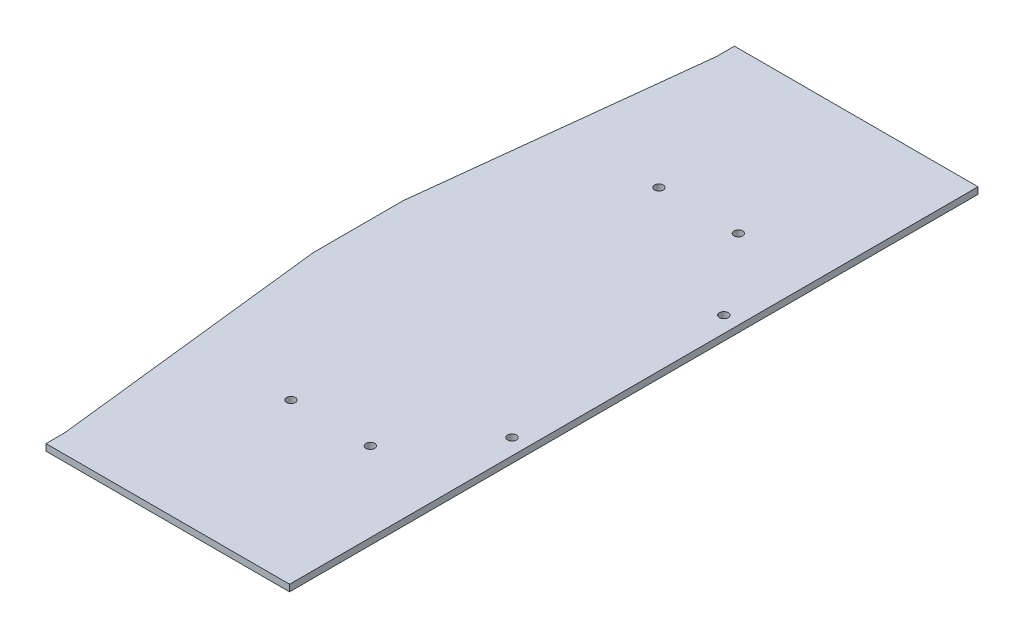
ISO-10303-21;
HEADER;
FILE_DESCRIPTION(('STEP AP214'),'2;1');
FILE_NAME('part.step','',(''),(''),'','','');
FILE_SCHEMA(('AUTOMOTIVE_DESIGN { 1 0 10303 214 1 1 1 1 }'));
ENDSEC;
DATA;
#1=APPLICATION_CONTEXT('core data for automotive mechanical design processes');
#2=APPLICATION_PROTOCOL_DEFINITION('international standard','automotive_design',2000,#1);
#3=PRODUCT_CONTEXT('',#1,'mechanical');
#4=PRODUCT('Part','Part','',(#3));
#5=PRODUCT_RELATED_PRODUCT_CATEGORY('part','',(#4));
#6=PRODUCT_DEFINITION_FORMATION('','',#4);
#7=PRODUCT_DEFINITION_CONTEXT('part definition',#1,'design');
#8=PRODUCT_DEFINITION('design','',#6,#7);
#9=PRODUCT_DEFINITION_SHAPE('','',#8);
#10=(LENGTH_UNIT() NAMED_UNIT(*) SI_UNIT(.MILLI.,.METRE.));
#11=(NAMED_UNIT(*) PLANE_ANGLE_UNIT() SI_UNIT($,.RADIAN.));
#12=(NAMED_UNIT(*) SI_UNIT($,.STERADIAN.) SOLID_ANGLE_UNIT());
#13=UNCERTAINTY_MEASURE_WITH_UNIT(LENGTH_MEASURE(1.E-05),#10,'distance_accuracy_value','');
#14=(GEOMETRIC_REPRESENTATION_CONTEXT(3) GLOBAL_UNCERTAINTY_ASSIGNED_CONTEXT((#13)) GLOBAL_UNIT_ASSIGNED_CONTEXT((#10,
#11,#12)) REPRESENTATION_CONTEXT('',''));
#15=CARTESIAN_POINT('',(0.,0.,0.));
#16=DIRECTION('',(0.,0.,1.));
#17=DIRECTION('',(1.,0.,0.));
#18=AXIS2_PLACEMENT_3D('',#15,#16,#17);
#19=CARTESIAN_POINT('',(0.,2.5,0.));
#20=DIRECTION('',(0.,1.,0.));
#21=DIRECTION('',(0.,0.,1.));
#22=AXIS2_PLACEMENT_3D('',#19,#20,#21);
#23=PLANE('',#22);
#24=CARTESIAN_POINT('',(129.120165849181,2.5,-40.7057352690958));
#25=DIRECTION('',(0.,1.,0.));
#26=DIRECTION('',(0.,0.,1.));
#27=AXIS2_PLACEMENT_3D('',#24,#25,#26);
#28=CIRCLE('',#27,1.65000000000002);
#29=CARTESIAN_POINT('',(129.120165849181,2.5,-39.0557352690958));
#30=VERTEX_POINT('',#29);
#31=EDGE_CURVE('E206',#30,#30,#28,.T.);
#32=ORIENTED_EDGE('',*,*,#31,.F.);
#33=EDGE_LOOP('',(#32));
#34=FACE_BOUND('',#33,.T.);
#35=CARTESIAN_POINT('',(75.1201658491807,2.5,68.7942647309042));
#36=DIRECTION('',(0.,1.,0.));
#37=DIRECTION('',(0.,0.,-1.));
#38=AXIS2_PLACEMENT_3D('',#35,#36,#37);
#39=CIRCLE('',#38,1.64999999999999);
#40=CARTESIAN_POINT('',(75.1201658491807,2.5,67.1442647309042));
#41=VERTEX_POINT('',#40);
#42=EDGE_CURVE('E194',#41,#41,#39,.T.);
#43=ORIENTED_EDGE('',*,*,#42,.F.);
#44=EDGE_LOOP('',(#43));
#45=FACE_BOUND('',#44,.T.);
#46=CARTESIAN_POINT('',(105.120165849181,2.5,-70.2057352690958));
#47=DIRECTION('',(0.,1.,0.));
#48=DIRECTION('',(0.,0.,1.));
#49=AXIS2_PLACEMENT_3D('',#46,#47,#48);
#50=CIRCLE('',#49,1.65);
#51=CARTESIAN_POINT('',(105.120165849181,2.5,-68.5557352690958));
#52=VERTEX_POINT('',#51);
#53=EDGE_CURVE('E136',#52,#52,#50,.T.);
#54=ORIENTED_EDGE('',*,*,#53,.F.);
#55=EDGE_LOOP('',(#54));
#56=FACE_BOUND('',#55,.T.);
#57=DIRECTION('',(1.,0.,0.));
#58=VECTOR('',#57,1.);
#59=CARTESIAN_POINT('',(43.1201658491807,2.5,129.294264730904));
#60=LINE('',#59,#58);
#61=CARTESIAN_POINT('',(43.1201658491807,2.5,129.294264730904));
#62=VERTEX_POINT('',#61);
#63=CARTESIAN_POINT('',(135.120165849181,2.5,129.294264730904));
#64=VERTEX_POINT('',#63);
#65=EDGE_CURVE('E96',#62,#64,#60,.T.);
#66=ORIENTED_EDGE('',*,*,#65,.T.);
#67=DIRECTION('',(0.,0.,-1.));
#68=VECTOR('',#67,1.);
#69=CARTESIAN_POINT('',(135.120165849181,2.5,129.294264730904));
#70=LINE('',#69,#68);
#71=CARTESIAN_POINT('',(135.120165849181,2.5,-130.705735269096));
#72=VERTEX_POINT('',#71);
#73=EDGE_CURVE('E168',#64,#72,#70,.T.);
#74=ORIENTED_EDGE('',*,*,#73,.T.);
#75=DIRECTION('',(-1.,0.,0.));
#76=VECTOR('',#75,1.);
#77=CARTESIAN_POINT('',(85.2736369996581,2.5,-130.705735269096));
#78=LINE('',#77,#76);
#79=CARTESIAN_POINT('',(43.1201658491807,2.5,-130.705735269096));
#80=VERTEX_POINT('',#79);
#81=EDGE_CURVE('E164',#72,#80,#78,.T.);
#82=ORIENTED_EDGE('',*,*,#81,.T.);
#83=DIRECTION('',(0.,0.,1.));
#84=VECTOR('',#83,1.);
#85=CARTESIAN_POINT('',(43.1201658491807,2.5,-123.705735269096));
#86=LINE('',#85,#84);
#87=CARTESIAN_POINT('',(43.1201658491807,2.5,-123.705735269096));
#88=VERTEX_POINT('',#87);
#89=EDGE_CURVE('E179',#80,#88,#86,.T.);
#90=ORIENTED_EDGE('',*,*,#89,.T.);
#91=DIRECTION('',(-0.112489015280939,0.,0.993652968314957));
#92=VECTOR('',#91,1.);
#93=CARTESIAN_POINT('',(31.1201658491807,2.5,-17.7057352690958));
#94=LINE('',#93,#92);
#95=CARTESIAN_POINT('',(31.1201658491807,2.5,-17.7057352690958));
#96=VERTEX_POINT('',#95);
#97=EDGE_CURVE('E116',#88,#96,#94,.T.);
#98=ORIENTED_EDGE('',*,*,#97,.T.);
#99=DIRECTION('',(0.,0.,1.));
#100=VECTOR('',#99,1.);
#101=CARTESIAN_POINT('',(31.1201658491807,2.5,-17.7057352690958));
#102=LINE('',#101,#100);
#103=CARTESIAN_POINT('',(31.1201658491807,2.5,16.2942647309042));
#104=VERTEX_POINT('',#103);
#105=EDGE_CURVE('E110',#96,#104,#102,.T.);
#106=ORIENTED_EDGE('',*,*,#105,.T.);
#107=DIRECTION('',(0.112489015280939,0.,0.993652968314957));
#108=VECTOR('',#107,1.);
#109=CARTESIAN_POINT('',(31.1201658491807,2.5,16.2942647309042));
#110=LINE('',#109,#108);
#111=CARTESIAN_POINT('',(43.1201658491807,2.5,122.294264730904));
#112=VERTEX_POINT('',#111);
#113=EDGE_CURVE('E114',#104,#112,#110,.T.);
#114=ORIENTED_EDGE('',*,*,#113,.T.);
#115=DIRECTION('',(0.,0.,1.));
#116=VECTOR('',#115,1.);
#117=CARTESIAN_POINT('',(43.1201658491807,2.5,122.294264730904));
#118=LINE('',#117,#116);
#119=EDGE_CURVE('E54',#112,#62,#118,.T.);
#120=ORIENTED_EDGE('',*,*,#119,.T.);
#121=EDGE_LOOP('',(#66,#74,#82,#90,#98,#106,#114,#120));
#122=FACE_BOUND('',#121,.T.);
#123=CARTESIAN_POINT('',(75.1201658491807,2.5,-70.2057352690958));
#124=DIRECTION('',(0.,1.,0.));
#125=DIRECTION('',(0.,0.,1.));
#126=AXIS2_PLACEMENT_3D('',#123,#124,#125);
#127=CIRCLE('',#126,1.65);
#128=CARTESIAN_POINT('',(75.1201658491807,2.5,-68.5557352690958));
#129=VERTEX_POINT('',#128);
#130=EDGE_CURVE('E188',#129,#129,#127,.T.);
#131=ORIENTED_EDGE('',*,*,#130,.F.);
#132=EDGE_LOOP('',(#131));
#133=FACE_BOUND('',#132,.T.);
#134=CARTESIAN_POINT('',(105.120165849181,2.5,68.7942647309042));
#135=DIRECTION('',(0.,1.,0.));
#136=DIRECTION('',(0.,0.,-1.));
#137=AXIS2_PLACEMENT_3D('',#134,#135,#136);
#138=CIRCLE('',#137,1.65);
#139=CARTESIAN_POINT('',(105.120165849181,2.5,67.1442647309042));
#140=VERTEX_POINT('',#139);
#141=EDGE_CURVE('E200',#140,#140,#138,.T.);
#142=ORIENTED_EDGE('',*,*,#141,.F.);
#143=EDGE_LOOP('',(#142));
#144=FACE_BOUND('',#143,.T.);
#145=CARTESIAN_POINT('',(129.120165849181,2.5,39.2942647309042));
#146=DIRECTION('',(0.,1.,0.));
#147=DIRECTION('',(0.,0.,-1.));
#148=AXIS2_PLACEMENT_3D('',#145,#146,#147);
#149=CIRCLE('',#148,1.65000000000002);
#150=CARTESIAN_POINT('',(129.120165849181,2.5,37.6442647309042));
#151=VERTEX_POINT('',#150);
#152=EDGE_CURVE('E212',#151,#151,#149,.T.);
#153=ORIENTED_EDGE('',*,*,#152,.F.);
#154=EDGE_LOOP('',(#153));
#155=FACE_BOUND('',#154,.T.);
#156=ADVANCED_FACE('F37',(#34,#45,#56,#122,#133,#144,#155),#23,.T.);
#157=CARTESIAN_POINT('',(0.,0.,0.));
#158=DIRECTION('',(0.,1.,0.));
#159=DIRECTION('',(0.,0.,1.));
#160=AXIS2_PLACEMENT_3D('',#157,#158,#159);
#161=PLANE('',#160);
#162=DIRECTION('',(1.,0.,0.));
#163=VECTOR('',#162,1.);
#164=CARTESIAN_POINT('',(85.2736369996581,0.,129.294264730904));
#165=LINE('',#164,#163);
#166=CARTESIAN_POINT('',(43.1201658491807,0.,129.294264730904));
#167=VERTEX_POINT('',#166);
#168=CARTESIAN_POINT('',(135.120165849181,0.,129.294264730904));
#169=VERTEX_POINT('',#168);
#170=EDGE_CURVE('E90',#167,#169,#165,.T.);
#171=ORIENTED_EDGE('',*,*,#170,.F.);
#172=DIRECTION('',(0.,0.,1.));
#173=VECTOR('',#172,1.);
#174=CARTESIAN_POINT('',(43.1201658491807,0.,122.294264730904));
#175=LINE('',#174,#173);
#176=CARTESIAN_POINT('',(43.1201658491807,0.,122.294264730904));
#177=VERTEX_POINT('',#176);
#178=EDGE_CURVE('E147',#177,#167,#175,.T.);
#179=ORIENTED_EDGE('',*,*,#178,.F.);
#180=DIRECTION('',(0.112489015280939,0.,0.993652968314957));
#181=VECTOR('',#180,1.);
#182=CARTESIAN_POINT('',(31.1201658491807,0.,16.2942647309042));
#183=LINE('',#182,#181);
#184=CARTESIAN_POINT('',(31.1201658491807,0.,16.2942647309042));
#185=VERTEX_POINT('',#184);
#186=EDGE_CURVE('E83',#185,#177,#183,.T.);
#187=ORIENTED_EDGE('',*,*,#186,.F.);
#188=DIRECTION('',(0.,0.,1.));
#189=VECTOR('',#188,1.);
#190=CARTESIAN_POINT('',(31.1201658491807,0.,-17.7057352690958));
#191=LINE('',#190,#189);
#192=CARTESIAN_POINT('',(31.1201658491807,0.,-17.7057352690958));
#193=VERTEX_POINT('',#192);
#194=EDGE_CURVE('E124',#193,#185,#191,.T.);
#195=ORIENTED_EDGE('',*,*,#194,.F.);
#196=DIRECTION('',(-0.112489015280939,0.,0.993652968314957));
#197=VECTOR('',#196,1.);
#198=CARTESIAN_POINT('',(31.1201658491807,0.,-17.7057352690958));
#199=LINE('',#198,#197);
#200=CARTESIAN_POINT('',(43.1201658491807,0.,-123.705735269096));
#201=VERTEX_POINT('',#200);
#202=EDGE_CURVE('E143',#201,#193,#199,.T.);
#203=ORIENTED_EDGE('',*,*,#202,.F.);
#204=DIRECTION('',(0.,0.,1.));
#205=VECTOR('',#204,1.);
#206=CARTESIAN_POINT('',(43.1201658491807,0.,-123.705735269096));
#207=LINE('',#206,#205);
#208=CARTESIAN_POINT('',(43.1201658491807,0.,-130.705735269096));
#209=VERTEX_POINT('',#208);
#210=EDGE_CURVE('E141',#209,#201,#207,.T.);
#211=ORIENTED_EDGE('',*,*,#210,.F.);
#212=DIRECTION('',(-1.,0.,0.));
#213=VECTOR('',#212,1.);
#214=CARTESIAN_POINT('',(43.1201658491807,0.,-130.705735269096));
#215=LINE('',#214,#213);
#216=CARTESIAN_POINT('',(135.120165849181,0.,-130.705735269096));
#217=VERTEX_POINT('',#216);
#218=EDGE_CURVE('E139',#217,#209,#215,.T.);
#219=ORIENTED_EDGE('',*,*,#218,.F.);
#220=DIRECTION('',(0.,0.,-1.));
#221=VECTOR('',#220,1.);
#222=CARTESIAN_POINT('',(135.120165849181,0.,129.294264730904));
#223=LINE('',#222,#221);
#224=EDGE_CURVE('E135',#169,#217,#223,.T.);
#225=ORIENTED_EDGE('',*,*,#224,.F.);
#226=EDGE_LOOP('',(#171,#179,#187,#195,#203,#211,#219,#225));
#227=FACE_BOUND('',#226,.T.);
#228=CARTESIAN_POINT('',(105.120165849181,0.,-70.2057352690958));
#229=DIRECTION('',(0.,1.,0.));
#230=DIRECTION('',(0.,0.,1.));
#231=AXIS2_PLACEMENT_3D('',#228,#229,#230);
#232=CIRCLE('',#231,1.65);
#233=CARTESIAN_POINT('',(105.120165849181,0.,-68.5557352690958));
#234=VERTEX_POINT('',#233);
#235=EDGE_CURVE('E185',#234,#234,#232,.T.);
#236=ORIENTED_EDGE('',*,*,#235,.T.);
#237=EDGE_LOOP('',(#236));
#238=FACE_BOUND('',#237,.T.);
#239=CARTESIAN_POINT('',(75.1201658491807,0.,-70.2057352690958));
#240=DIRECTION('',(0.,1.,0.));
#241=DIRECTION('',(0.,0.,1.));
#242=AXIS2_PLACEMENT_3D('',#239,#240,#241);
#243=CIRCLE('',#242,1.65);
#244=CARTESIAN_POINT('',(75.1201658491807,0.,-68.5557352690958));
#245=VERTEX_POINT('',#244);
#246=EDGE_CURVE('E191',#245,#245,#243,.T.);
#247=ORIENTED_EDGE('',*,*,#246,.T.);
#248=EDGE_LOOP('',(#247));
#249=FACE_BOUND('',#248,.T.);
#250=CARTESIAN_POINT('',(75.1201658491807,0.,68.7942647309042));
#251=DIRECTION('',(0.,1.,0.));
#252=DIRECTION('',(0.,0.,-1.));
#253=AXIS2_PLACEMENT_3D('',#250,#251,#252);
#254=CIRCLE('',#253,1.64999999999999);
#255=CARTESIAN_POINT('',(75.1201658491807,0.,67.1442647309042));
#256=VERTEX_POINT('',#255);
#257=EDGE_CURVE('E197',#256,#256,#254,.T.);
#258=ORIENTED_EDGE('',*,*,#257,.T.);
#259=EDGE_LOOP('',(#258));
#260=FACE_BOUND('',#259,.T.);
#261=CARTESIAN_POINT('',(105.120165849181,0.,68.7942647309042));
#262=DIRECTION('',(0.,1.,0.));
#263=DIRECTION('',(0.,0.,-1.));
#264=AXIS2_PLACEMENT_3D('',#261,#262,#263);
#265=CIRCLE('',#264,1.65);
#266=CARTESIAN_POINT('',(105.120165849181,0.,67.1442647309042));
#267=VERTEX_POINT('',#266);
#268=EDGE_CURVE('E203',#267,#267,#265,.T.);
#269=ORIENTED_EDGE('',*,*,#268,.T.);
#270=EDGE_LOOP('',(#269));
#271=FACE_BOUND('',#270,.T.);
#272=CARTESIAN_POINT('',(129.120165849181,0.,-40.7057352690958));
#273=DIRECTION('',(0.,1.,0.));
#274=DIRECTION('',(0.,0.,1.));
#275=AXIS2_PLACEMENT_3D('',#272,#273,#274);
#276=CIRCLE('',#275,1.65000000000002);
#277=CARTESIAN_POINT('',(129.120165849181,0.,-39.0557352690958));
#278=VERTEX_POINT('',#277);
#279=EDGE_CURVE('E209',#278,#278,#276,.T.);
#280=ORIENTED_EDGE('',*,*,#279,.T.);
#281=EDGE_LOOP('',(#280));
#282=FACE_BOUND('',#281,.T.);
#283=CARTESIAN_POINT('',(129.120165849181,0.,39.2942647309042));
#284=DIRECTION('',(0.,1.,0.));
#285=DIRECTION('',(0.,0.,-1.));
#286=AXIS2_PLACEMENT_3D('',#283,#284,#285);
#287=CIRCLE('',#286,1.65000000000002);
#288=CARTESIAN_POINT('',(129.120165849181,0.,37.6442647309042));
#289=VERTEX_POINT('',#288);
#290=EDGE_CURVE('E215',#289,#289,#287,.T.);
#291=ORIENTED_EDGE('',*,*,#290,.T.);
#292=EDGE_LOOP('',(#291));
#293=FACE_BOUND('',#292,.T.);
#294=ADVANCED_FACE('F169',(#227,#238,#249,#260,#271,#282,#293),#161,.F.);
#295=CARTESIAN_POINT('',(85.2736369996581,2.5,129.294264730904));
#296=DIRECTION('',(0.,0.,-1.));
#297=DIRECTION('',(-1.,0.,0.));
#298=AXIS2_PLACEMENT_3D('',#295,#296,#297);
#299=PLANE('',#298);
#300=ORIENTED_EDGE('',*,*,#170,.T.);
#301=DIRECTION('',(0.,-1.,0.));
#302=VECTOR('',#301,1.);
#303=CARTESIAN_POINT('',(135.120165849181,2.5,129.294264730904));
#304=LINE('',#303,#302);
#305=EDGE_CURVE('E11',#64,#169,#304,.T.);
#306=ORIENTED_EDGE('',*,*,#305,.F.);
#307=ORIENTED_EDGE('',*,*,#65,.F.);
#308=DIRECTION('',(0.,-1.,0.));
#309=VECTOR('',#308,1.);
#310=CARTESIAN_POINT('',(43.1201658491807,2.5,129.294264730904));
#311=LINE('',#310,#309);
#312=EDGE_CURVE('E130',#62,#167,#311,.T.);
#313=ORIENTED_EDGE('',*,*,#312,.T.);
#314=EDGE_LOOP('',(#300,#306,#307,#313));
#315=FACE_BOUND('',#314,.T.);
#316=ADVANCED_FACE('F39',(#315),#299,.F.);
#317=CARTESIAN_POINT('',(135.120165849181,2.5,129.294264730904));
#318=DIRECTION('',(-1.,0.,0.));
#319=DIRECTION('',(0.,0.,1.));
#320=AXIS2_PLACEMENT_3D('',#317,#318,#319);
#321=PLANE('',#320);
#322=ORIENTED_EDGE('',*,*,#224,.T.);
#323=DIRECTION('',(0.,-1.,0.));
#324=VECTOR('',#323,1.);
#325=CARTESIAN_POINT('',(135.120165849181,2.5,-130.705735269096));
#326=LINE('',#325,#324);
#327=EDGE_CURVE('E46',#72,#217,#326,.T.);
#328=ORIENTED_EDGE('',*,*,#327,.F.);
#329=ORIENTED_EDGE('',*,*,#73,.F.);
#330=ORIENTED_EDGE('',*,*,#305,.T.);
#331=EDGE_LOOP('',(#322,#328,#329,#330));
#332=FACE_BOUND('',#331,.T.);
#333=ADVANCED_FACE('F167',(#332),#321,.F.);
#334=CARTESIAN_POINT('',(43.1201658491807,2.5,-130.705735269096));
#335=DIRECTION('',(0.,0.,1.));
#336=DIRECTION('',(1.,0.,0.));
#337=AXIS2_PLACEMENT_3D('',#334,#335,#336);
#338=PLANE('',#337);
#339=ORIENTED_EDGE('',*,*,#218,.T.);
#340=DIRECTION('',(0.,-1.,0.));
#341=VECTOR('',#340,1.);
#342=CARTESIAN_POINT('',(43.1201658491807,2.5,-130.705735269096));
#343=LINE('',#342,#341);
#344=EDGE_CURVE('E156',#80,#209,#343,.T.);
#345=ORIENTED_EDGE('',*,*,#344,.F.);
#346=ORIENTED_EDGE('',*,*,#81,.F.);
#347=ORIENTED_EDGE('',*,*,#327,.T.);
#348=EDGE_LOOP('',(#339,#345,#346,#347));
#349=FACE_BOUND('',#348,.T.);
#350=ADVANCED_FACE('F162',(#349),#338,.F.);
#351=CARTESIAN_POINT('',(43.1201658491807,2.5,-123.705735269096));
#352=DIRECTION('',(1.,0.,0.));
#353=DIRECTION('',(0.,0.,-1.));
#354=AXIS2_PLACEMENT_3D('',#351,#352,#353);
#355=PLANE('',#354);
#356=ORIENTED_EDGE('',*,*,#210,.T.);
#357=DIRECTION('',(0.,-1.,0.));
#358=VECTOR('',#357,1.);
#359=CARTESIAN_POINT('',(43.1201658491807,2.5,-123.705735269096));
#360=LINE('',#359,#358);
#361=EDGE_CURVE('E153',#88,#201,#360,.T.);
#362=ORIENTED_EDGE('',*,*,#361,.F.);
#363=ORIENTED_EDGE('',*,*,#89,.F.);
#364=ORIENTED_EDGE('',*,*,#344,.T.);
#365=EDGE_LOOP('',(#356,#362,#363,#364));
#366=FACE_BOUND('',#365,.T.);
#367=ADVANCED_FACE('F175',(#366),#355,.F.);
#368=CARTESIAN_POINT('',(31.1201658491807,2.5,-17.7057352690958));
#369=DIRECTION('',(0.993652968314957,0.,0.112489015280939));
#370=DIRECTION('',(0.112489015280939,0.,-0.993652968314957));
#371=AXIS2_PLACEMENT_3D('',#368,#369,#370);
#372=PLANE('',#371);
#373=ORIENTED_EDGE('',*,*,#202,.T.);
#374=DIRECTION('',(0.,-1.,0.));
#375=VECTOR('',#374,1.);
#376=CARTESIAN_POINT('',(31.1201658491807,2.5,-17.7057352690958));
#377=LINE('',#376,#375);
#378=EDGE_CURVE('E125',#96,#193,#377,.T.);
#379=ORIENTED_EDGE('',*,*,#378,.F.);
#380=ORIENTED_EDGE('',*,*,#97,.F.);
#381=ORIENTED_EDGE('',*,*,#361,.T.);
#382=EDGE_LOOP('',(#373,#379,#380,#381));
#383=FACE_BOUND('',#382,.T.);
#384=ADVANCED_FACE('F178',(#383),#372,.F.);
#385=CARTESIAN_POINT('',(31.1201658491807,2.5,-17.7057352690958));
#386=DIRECTION('',(1.,0.,0.));
#387=DIRECTION('',(0.,0.,-1.));
#388=AXIS2_PLACEMENT_3D('',#385,#386,#387);
#389=PLANE('',#388);
#390=ORIENTED_EDGE('',*,*,#194,.T.);
#391=DIRECTION('',(0.,-1.,0.));
#392=VECTOR('',#391,1.);
#393=CARTESIAN_POINT('',(31.1201658491807,2.5,16.2942647309042));
#394=LINE('',#393,#392);
#395=EDGE_CURVE('E121',#104,#185,#394,.T.);
#396=ORIENTED_EDGE('',*,*,#395,.F.);
#397=ORIENTED_EDGE('',*,*,#105,.F.);
#398=ORIENTED_EDGE('',*,*,#378,.T.);
#399=EDGE_LOOP('',(#390,#396,#397,#398));
#400=FACE_BOUND('',#399,.T.);
#401=ADVANCED_FACE('F122',(#400),#389,.F.);
#402=CARTESIAN_POINT('',(31.1201658491807,2.5,16.2942647309042));
#403=DIRECTION('',(0.993652968314957,0.,-0.112489015280939));
#404=DIRECTION('',(-0.112489015280939,0.,-0.993652968314957));
#405=AXIS2_PLACEMENT_3D('',#402,#403,#404);
#406=PLANE('',#405);
#407=ORIENTED_EDGE('',*,*,#186,.T.);
#408=DIRECTION('',(0.,-1.,0.));
#409=VECTOR('',#408,1.);
#410=CARTESIAN_POINT('',(43.1201658491807,2.5,122.294264730904));
#411=LINE('',#410,#409);
#412=EDGE_CURVE('E126',#112,#177,#411,.T.);
#413=ORIENTED_EDGE('',*,*,#412,.F.);
#414=ORIENTED_EDGE('',*,*,#113,.F.);
#415=ORIENTED_EDGE('',*,*,#395,.T.);
#416=EDGE_LOOP('',(#407,#413,#414,#415));
#417=FACE_BOUND('',#416,.T.);
#418=ADVANCED_FACE('F128',(#417),#406,.F.);
#419=CARTESIAN_POINT('',(43.1201658491807,2.5,122.294264730904));
#420=DIRECTION('',(1.,0.,0.));
#421=DIRECTION('',(0.,0.,-1.));
#422=AXIS2_PLACEMENT_3D('',#419,#420,#421);
#423=PLANE('',#422);
#424=ORIENTED_EDGE('',*,*,#178,.T.);
#425=ORIENTED_EDGE('',*,*,#312,.F.);
#426=ORIENTED_EDGE('',*,*,#119,.F.);
#427=ORIENTED_EDGE('',*,*,#412,.T.);
#428=EDGE_LOOP('',(#424,#425,#426,#427));
#429=FACE_BOUND('',#428,.T.);
#430=ADVANCED_FACE('F237',(#429),#423,.F.);
#431=CARTESIAN_POINT('',(105.120165849181,2.5,-70.2057352690958));
#432=DIRECTION('',(0.,-1.,0.));
#433=DIRECTION('',(0.,0.,-1.));
#434=AXIS2_PLACEMENT_3D('',#431,#432,#433);
#435=CYLINDRICAL_SURFACE('',#434,1.65);
#436=ORIENTED_EDGE('',*,*,#53,.T.);
#437=EDGE_LOOP('',(#436));
#438=FACE_BOUND('',#437,.T.);
#439=ORIENTED_EDGE('',*,*,#235,.F.);
#440=EDGE_LOOP('',(#439));
#441=FACE_BOUND('',#440,.T.);
#442=ADVANCED_FACE('F234',(#438,#441),#435,.F.);
#443=CARTESIAN_POINT('',(75.1201658491807,2.5,-70.2057352690958));
#444=DIRECTION('',(0.,-1.,0.));
#445=DIRECTION('',(0.,0.,-1.));
#446=AXIS2_PLACEMENT_3D('',#443,#444,#445);
#447=CYLINDRICAL_SURFACE('',#446,1.65);
#448=ORIENTED_EDGE('',*,*,#130,.T.);
#449=EDGE_LOOP('',(#448));
#450=FACE_BOUND('',#449,.T.);
#451=ORIENTED_EDGE('',*,*,#246,.F.);
#452=EDGE_LOOP('',(#451));
#453=FACE_BOUND('',#452,.T.);
#454=ADVANCED_FACE('F317',(#450,#453),#447,.F.);
#455=CARTESIAN_POINT('',(75.1201658491807,2.5,68.7942647309042));
#456=DIRECTION('',(0.,-1.,0.));
#457=DIRECTION('',(0.,0.,-1.));
#458=AXIS2_PLACEMENT_3D('',#455,#456,#457);
#459=CYLINDRICAL_SURFACE('',#458,1.64999999999999);
#460=ORIENTED_EDGE('',*,*,#42,.T.);
#461=EDGE_LOOP('',(#460));
#462=FACE_BOUND('',#461,.T.);
#463=ORIENTED_EDGE('',*,*,#257,.F.);
#464=EDGE_LOOP('',(#463));
#465=FACE_BOUND('',#464,.T.);
#466=ADVANCED_FACE('F325',(#462,#465),#459,.F.);
#467=CARTESIAN_POINT('',(105.120165849181,2.5,68.7942647309042));
#468=DIRECTION('',(0.,-1.,0.));
#469=DIRECTION('',(0.,0.,-1.));
#470=AXIS2_PLACEMENT_3D('',#467,#468,#469);
#471=CYLINDRICAL_SURFACE('',#470,1.65);
#472=ORIENTED_EDGE('',*,*,#141,.T.);
#473=EDGE_LOOP('',(#472));
#474=FACE_BOUND('',#473,.T.);
#475=ORIENTED_EDGE('',*,*,#268,.F.);
#476=EDGE_LOOP('',(#475));
#477=FACE_BOUND('',#476,.T.);
#478=ADVANCED_FACE('F333',(#474,#477),#471,.F.);
#479=CARTESIAN_POINT('',(129.120165849181,2.5,-40.7057352690958));
#480=DIRECTION('',(0.,-1.,0.));
#481=DIRECTION('',(0.,0.,-1.));
#482=AXIS2_PLACEMENT_3D('',#479,#480,#481);
#483=CYLINDRICAL_SURFACE('',#482,1.65000000000002);
#484=ORIENTED_EDGE('',*,*,#31,.T.);
#485=EDGE_LOOP('',(#484));
#486=FACE_BOUND('',#485,.T.);
#487=ORIENTED_EDGE('',*,*,#279,.F.);
#488=EDGE_LOOP('',(#487));
#489=FACE_BOUND('',#488,.T.);
#490=ADVANCED_FACE('F342',(#486,#489),#483,.F.);
#491=CARTESIAN_POINT('',(129.120165849181,2.5,39.2942647309042));
#492=DIRECTION('',(0.,-1.,0.));
#493=DIRECTION('',(0.,0.,-1.));
#494=AXIS2_PLACEMENT_3D('',#491,#492,#493);
#495=CYLINDRICAL_SURFACE('',#494,1.65000000000002);
#496=ORIENTED_EDGE('',*,*,#152,.T.);
#497=EDGE_LOOP('',(#496));
#498=FACE_BOUND('',#497,.T.);
#499=ORIENTED_EDGE('',*,*,#290,.F.);
#500=EDGE_LOOP('',(#499));
#501=FACE_BOUND('',#500,.T.);
#502=ADVANCED_FACE('F221',(#498,#501),#495,.F.);
#503=CLOSED_SHELL('',(#156,#294,#316,#333,#350,#367,#384,#401,#418,#430,#442,#454,#466,#478,
#490,#502));
#504=MANIFOLD_SOLID_BREP('B2',#503);
#505=ADVANCED_BREP_SHAPE_REPRESENTATION('',(#18,#504),#14);
#506=SHAPE_DEFINITION_REPRESENTATION(#9,#505);
ENDSEC;
END-ISO-10303-21;
